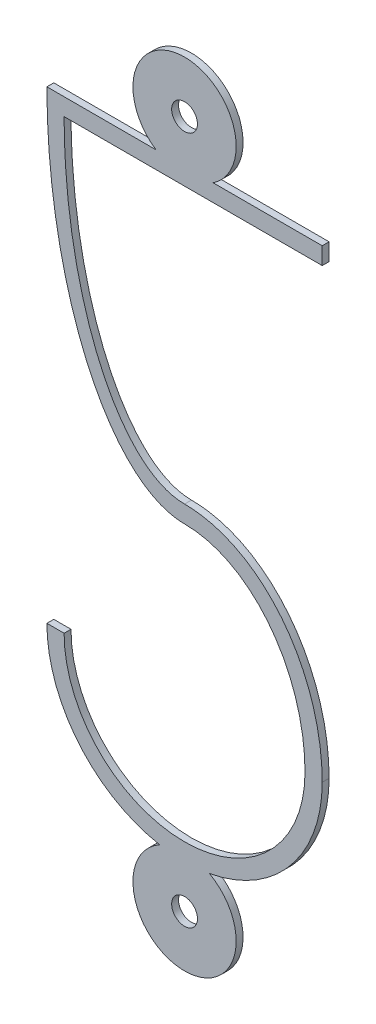
ISO-10303-21;
HEADER;
FILE_DESCRIPTION(('STEP AP214'),'2;1');
FILE_NAME('part.step','',(''),(''),'','','');
FILE_SCHEMA(('AUTOMOTIVE_DESIGN { 1 0 10303 214 1 1 1 1 }'));
ENDSEC;
DATA;
#1=APPLICATION_CONTEXT('core data for automotive mechanical design processes');
#2=APPLICATION_PROTOCOL_DEFINITION('international standard','automotive_design',2000,#1);
#3=PRODUCT_CONTEXT('',#1,'mechanical');
#4=PRODUCT('Part','Part','',(#3));
#5=PRODUCT_RELATED_PRODUCT_CATEGORY('part','',(#4));
#6=PRODUCT_DEFINITION_FORMATION('','',#4);
#7=PRODUCT_DEFINITION_CONTEXT('part definition',#1,'design');
#8=PRODUCT_DEFINITION('design','',#6,#7);
#9=PRODUCT_DEFINITION_SHAPE('','',#8);
#10=(LENGTH_UNIT() NAMED_UNIT(*) SI_UNIT(.MILLI.,.METRE.));
#11=(NAMED_UNIT(*) PLANE_ANGLE_UNIT() SI_UNIT($,.RADIAN.));
#12=(NAMED_UNIT(*) SI_UNIT($,.STERADIAN.) SOLID_ANGLE_UNIT());
#13=UNCERTAINTY_MEASURE_WITH_UNIT(LENGTH_MEASURE(1.E-05),#10,'distance_accuracy_value','');
#14=(GEOMETRIC_REPRESENTATION_CONTEXT(3) GLOBAL_UNCERTAINTY_ASSIGNED_CONTEXT((#13)) GLOBAL_UNIT_ASSIGNED_CONTEXT((#10,
#11,#12)) REPRESENTATION_CONTEXT('',''));
#15=CARTESIAN_POINT('',(0.,0.,0.));
#16=DIRECTION('',(0.,0.,1.));
#17=DIRECTION('',(1.,0.,0.));
#18=AXIS2_PLACEMENT_3D('',#15,#16,#17);
#19=CARTESIAN_POINT('',(-1.32932183617601E-13,8.75000000000002,0.1));
#20=DIRECTION('',(0.,0.,-1.));
#21=DIRECTION('',(-1.,0.,0.));
#22=AXIS2_PLACEMENT_3D('',#19,#20,#21);
#23=PLANE('',#22);
#24=CARTESIAN_POINT('',(-1.32932183617601E-13,8.75000000000002,0.1));
#25=DIRECTION('',(0.,0.,1.));
#26=DIRECTION('',(0.,1.,0.));
#27=AXIS2_PLACEMENT_3D('',#24,#25,#26);
#28=ELLIPSE('',#27,8.99999999999974,4.00000000000008);
#29=CARTESIAN_POINT('',(-4.00000000000022,8.74999999999979,0.1));
#30=VERTEX_POINT('',#29);
#31=CARTESIAN_POINT('',(0.,-0.250000000000186,0.1));
#32=VERTEX_POINT('',#31);
#33=EDGE_CURVE('E197',#30,#32,#28,.T.);
#34=ORIENTED_EDGE('',*,*,#33,.T.);
#35=CARTESIAN_POINT('',(0.,-4.74999999999968,0.1));
#36=DIRECTION('',(0.,0.,-1.));
#37=DIRECTION('',(0.,1.,0.));
#38=AXIS2_PLACEMENT_3D('',#35,#36,#37);
#39=ELLIPSE('',#38,4.49999999999949,3.49999999999958);
#40=CARTESIAN_POINT('',(3.49999999999954,-4.74999999999968,0.1));
#41=VERTEX_POINT('',#40);
#42=EDGE_CURVE('E115',#32,#41,#39,.T.);
#43=ORIENTED_EDGE('',*,*,#42,.T.);
#44=CARTESIAN_POINT('',(0.,-4.74999999999968,0.1));
#45=DIRECTION('',(0.,0.,-1.));
#46=DIRECTION('',(-1.,0.,0.));
#47=AXIS2_PLACEMENT_3D('',#44,#45,#46);
#48=CIRCLE('',#47,3.49999999999954);
#49=CARTESIAN_POINT('',(-3.49999999999949,-4.74999999999968,0.1));
#50=VERTEX_POINT('',#49);
#51=EDGE_CURVE('E230',#41,#50,#48,.T.);
#52=ORIENTED_EDGE('',*,*,#51,.T.);
#53=DIRECTION('',(-1.,0.,0.));
#54=VECTOR('',#53,1.);
#55=CARTESIAN_POINT('',(-4.00000000000022,-4.74999999999968,0.1));
#56=LINE('',#55,#54);
#57=CARTESIAN_POINT('',(-4.00000000000021,-4.74999999999968,0.1));
#58=VERTEX_POINT('',#57);
#59=EDGE_CURVE('E249',#50,#58,#56,.T.);
#60=ORIENTED_EDGE('',*,*,#59,.T.);
#61=CARTESIAN_POINT('',(0.,-4.74999999999968,0.1));
#62=DIRECTION('',(0.,0.,1.));
#63=DIRECTION('',(1.,0.,0.));
#64=AXIS2_PLACEMENT_3D('',#61,#62,#63);
#65=CIRCLE('',#64,4.00000000000021);
#66=CARTESIAN_POINT('',(-0.720779017653949,-8.68452380952371,0.1));
#67=VERTEX_POINT('',#66);
#68=EDGE_CURVE('E246',#58,#67,#65,.T.);
#69=ORIENTED_EDGE('',*,*,#68,.T.);
#70=CARTESIAN_POINT('',(-1.32932183617601E-13,-10.,0.1));
#71=DIRECTION('',(0.,0.,1.));
#72=DIRECTION('',(1.,0.,0.));
#73=AXIS2_PLACEMENT_3D('',#70,#71,#72);
#74=CIRCLE('',#73,1.5);
#75=CARTESIAN_POINT('',(0.720779017653747,-8.68452380952375,0.1));
#76=VERTEX_POINT('',#75);
#77=EDGE_CURVE('E248',#67,#76,#74,.T.);
#78=ORIENTED_EDGE('',*,*,#77,.T.);
#79=CARTESIAN_POINT('',(0.,-4.74999999999968,0.1));
#80=DIRECTION('',(0.,0.,1.));
#81=DIRECTION('',(1.,0.,0.));
#82=AXIS2_PLACEMENT_3D('',#79,#80,#81);
#83=CIRCLE('',#82,4.00000000000022);
#84=CARTESIAN_POINT('',(4.00000000000022,-4.74999999999968,0.1));
#85=VERTEX_POINT('',#84);
#86=EDGE_CURVE('E251',#76,#85,#83,.T.);
#87=ORIENTED_EDGE('',*,*,#86,.T.);
#88=CARTESIAN_POINT('',(0.,-4.74999999999968,0.1));
#89=DIRECTION('',(0.,0.,1.));
#90=DIRECTION('',(0.,1.,0.));
#91=AXIS2_PLACEMENT_3D('',#88,#89,#90);
#92=ELLIPSE('',#91,4.99999999999986,4.00000000000022);
#93=CARTESIAN_POINT('',(0.,0.250000000000188,0.1));
#94=VERTEX_POINT('',#93);
#95=EDGE_CURVE('E257',#85,#94,#92,.T.);
#96=ORIENTED_EDGE('',*,*,#95,.T.);
#97=CARTESIAN_POINT('',(-1.32932183617601E-13,8.24999999999906,0.1));
#98=DIRECTION('',(0.,0.,-1.));
#99=DIRECTION('',(0.,-1.,0.));
#100=AXIS2_PLACEMENT_3D('',#97,#98,#99);
#101=ELLIPSE('',#100,7.99999999999887,3.49999999999982);
#102=CARTESIAN_POINT('',(-3.49999999999995,8.24999999999906,0.1));
#103=VERTEX_POINT('',#102);
#104=EDGE_CURVE('E260',#94,#103,#101,.T.);
#105=ORIENTED_EDGE('',*,*,#104,.T.);
#106=DIRECTION('',(1.,0.,0.));
#107=VECTOR('',#106,1.);
#108=CARTESIAN_POINT('',(4.00000000000022,8.24999999999906,0.1));
#109=LINE('',#108,#107);
#110=CARTESIAN_POINT('',(4.00000000000022,8.24999999999906,0.1));
#111=VERTEX_POINT('',#110);
#112=EDGE_CURVE('E302',#103,#111,#109,.T.);
#113=ORIENTED_EDGE('',*,*,#112,.T.);
#114=DIRECTION('',(0.,1.,0.));
#115=VECTOR('',#114,1.);
#116=CARTESIAN_POINT('',(4.00000000000022,8.74999999999979,0.1));
#117=LINE('',#116,#115);
#118=CARTESIAN_POINT('',(4.00000000000022,8.74999999999979,0.1));
#119=VERTEX_POINT('',#118);
#120=EDGE_CURVE('E152',#111,#119,#117,.T.);
#121=ORIENTED_EDGE('',*,*,#120,.T.);
#122=DIRECTION('',(-1.,0.,0.));
#123=VECTOR('',#122,1.);
#124=CARTESIAN_POINT('',(0.829156197588529,8.74999999999979,0.1));
#125=LINE('',#124,#123);
#126=CARTESIAN_POINT('',(0.829156197588468,8.74999999999988,0.1));
#127=VERTEX_POINT('',#126);
#128=EDGE_CURVE('E146',#119,#127,#125,.T.);
#129=ORIENTED_EDGE('',*,*,#128,.T.);
#130=CARTESIAN_POINT('',(-1.32932183617601E-13,10.,0.1));
#131=DIRECTION('',(0.,0.,1.));
#132=DIRECTION('',(1.,0.,0.));
#133=AXIS2_PLACEMENT_3D('',#130,#131,#132);
#134=CIRCLE('',#133,1.49999999999996);
#135=CARTESIAN_POINT('',(-0.829156197588745,8.75000000000002,0.1));
#136=VERTEX_POINT('',#135);
#137=EDGE_CURVE('E150',#127,#136,#134,.T.);
#138=ORIENTED_EDGE('',*,*,#137,.T.);
#139=DIRECTION('',(-1.,0.,0.));
#140=VECTOR('',#139,1.);
#141=CARTESIAN_POINT('',(-4.00000000000022,8.74999999999979,0.1));
#142=LINE('',#141,#140);
#143=EDGE_CURVE('E54',#136,#30,#142,.T.);
#144=ORIENTED_EDGE('',*,*,#143,.T.);
#145=EDGE_LOOP('',(#34,#43,#52,#60,#69,#78,#87,#96,#105,#113,#121,#129,#138,#144));
#146=FACE_BOUND('',#145,.T.);
#147=CARTESIAN_POINT('',(-1.32932183617601E-13,-10.,0.1));
#148=DIRECTION('',(0.,0.,1.));
#149=DIRECTION('',(1.,0.,0.));
#150=AXIS2_PLACEMENT_3D('',#147,#148,#149);
#151=CIRCLE('',#150,0.374999999999808);
#152=CARTESIAN_POINT('',(0.374999999999675,-10.,0.1));
#153=VERTEX_POINT('',#152);
#154=EDGE_CURVE('E174',#153,#153,#151,.T.);
#155=ORIENTED_EDGE('',*,*,#154,.F.);
#156=EDGE_LOOP('',(#155));
#157=FACE_BOUND('',#156,.T.);
#158=CARTESIAN_POINT('',(-1.32932183617601E-13,10.,0.1));
#159=DIRECTION('',(0.,0.,1.));
#160=DIRECTION('',(1.,0.,0.));
#161=AXIS2_PLACEMENT_3D('',#158,#159,#160);
#162=CIRCLE('',#161,0.374999999999941);
#163=CARTESIAN_POINT('',(0.374999999999809,10.,0.1));
#164=VERTEX_POINT('',#163);
#165=EDGE_CURVE('E449',#164,#164,#162,.T.);
#166=ORIENTED_EDGE('',*,*,#165,.F.);
#167=EDGE_LOOP('',(#166));
#168=FACE_BOUND('',#167,.T.);
#169=ADVANCED_FACE('F36',(#146,#157,#168),#23,.F.);
#170=CARTESIAN_POINT('',(-1.32932183617601E-13,8.75000000000002,-0.1));
#171=DIRECTION('',(0.,0.,-1.));
#172=DIRECTION('',(-1.,0.,0.));
#173=AXIS2_PLACEMENT_3D('',#170,#171,#172);
#174=PLANE('',#173);
#175=CARTESIAN_POINT('',(-1.32932183617601E-13,-10.,-0.1));
#176=DIRECTION('',(0.,0.,1.));
#177=DIRECTION('',(1.,0.,0.));
#178=AXIS2_PLACEMENT_3D('',#175,#176,#177);
#179=CIRCLE('',#178,0.374999999999808);
#180=CARTESIAN_POINT('',(0.374999999999675,-10.,-0.1));
#181=VERTEX_POINT('',#180);
#182=EDGE_CURVE('E454',#181,#181,#179,.T.);
#183=ORIENTED_EDGE('',*,*,#182,.T.);
#184=EDGE_LOOP('',(#183));
#185=FACE_BOUND('',#184,.T.);
#186=CARTESIAN_POINT('',(-1.32932183617601E-13,8.75000000000002,-0.1));
#187=DIRECTION('',(0.,0.,1.));
#188=DIRECTION('',(0.,1.,0.));
#189=AXIS2_PLACEMENT_3D('',#186,#187,#188);
#190=ELLIPSE('',#189,8.99999999999974,4.00000000000008);
#191=CARTESIAN_POINT('',(-4.00000000000022,8.74999999999979,-0.1));
#192=VERTEX_POINT('',#191);
#193=CARTESIAN_POINT('',(0.,-0.250000000000186,-0.1));
#194=VERTEX_POINT('',#193);
#195=EDGE_CURVE('E170',#192,#194,#190,.T.);
#196=ORIENTED_EDGE('',*,*,#195,.F.);
#197=DIRECTION('',(-1.,0.,0.));
#198=VECTOR('',#197,1.);
#199=CARTESIAN_POINT('',(-4.00000000000022,8.74999999999979,-0.1));
#200=LINE('',#199,#198);
#201=CARTESIAN_POINT('',(-0.829156197588745,8.75000000000002,-0.1));
#202=VERTEX_POINT('',#201);
#203=EDGE_CURVE('E107',#202,#192,#200,.T.);
#204=ORIENTED_EDGE('',*,*,#203,.F.);
#205=CARTESIAN_POINT('',(-1.32932183617601E-13,10.,-0.1));
#206=DIRECTION('',(0.,0.,1.));
#207=DIRECTION('',(1.,0.,0.));
#208=AXIS2_PLACEMENT_3D('',#205,#206,#207);
#209=CIRCLE('',#208,1.49999999999996);
#210=CARTESIAN_POINT('',(0.829156197588468,8.74999999999988,-0.1));
#211=VERTEX_POINT('',#210);
#212=EDGE_CURVE('E101',#211,#202,#209,.T.);
#213=ORIENTED_EDGE('',*,*,#212,.F.);
#214=DIRECTION('',(-1.,0.,0.));
#215=VECTOR('',#214,1.);
#216=CARTESIAN_POINT('',(0.829156197588529,8.74999999999979,-0.1));
#217=LINE('',#216,#215);
#218=CARTESIAN_POINT('',(4.00000000000022,8.74999999999979,-0.1));
#219=VERTEX_POINT('',#218);
#220=EDGE_CURVE('E160',#219,#211,#217,.T.);
#221=ORIENTED_EDGE('',*,*,#220,.F.);
#222=DIRECTION('',(0.,1.,0.));
#223=VECTOR('',#222,1.);
#224=CARTESIAN_POINT('',(4.00000000000022,8.74999999999979,-0.1));
#225=LINE('',#224,#223);
#226=CARTESIAN_POINT('',(4.00000000000022,8.24999999999906,-0.1));
#227=VERTEX_POINT('',#226);
#228=EDGE_CURVE('E192',#227,#219,#225,.T.);
#229=ORIENTED_EDGE('',*,*,#228,.F.);
#230=DIRECTION('',(1.,0.,0.));
#231=VECTOR('',#230,1.);
#232=CARTESIAN_POINT('',(4.00000000000022,8.24999999999906,-0.1));
#233=LINE('',#232,#231);
#234=CARTESIAN_POINT('',(-3.49999999999995,8.24999999999906,-0.1));
#235=VERTEX_POINT('',#234);
#236=EDGE_CURVE('E190',#235,#227,#233,.T.);
#237=ORIENTED_EDGE('',*,*,#236,.F.);
#238=CARTESIAN_POINT('',(-1.32932183617601E-13,8.24999999999906,-0.1));
#239=DIRECTION('',(0.,0.,-1.));
#240=DIRECTION('',(0.,-1.,0.));
#241=AXIS2_PLACEMENT_3D('',#238,#239,#240);
#242=ELLIPSE('',#241,7.99999999999887,3.49999999999982);
#243=CARTESIAN_POINT('',(0.,0.250000000000188,-0.1));
#244=VERTEX_POINT('',#243);
#245=EDGE_CURVE('E188',#244,#235,#242,.T.);
#246=ORIENTED_EDGE('',*,*,#245,.F.);
#247=CARTESIAN_POINT('',(0.,-4.74999999999968,-0.1));
#248=DIRECTION('',(0.,0.,1.));
#249=DIRECTION('',(0.,1.,0.));
#250=AXIS2_PLACEMENT_3D('',#247,#248,#249);
#251=ELLIPSE('',#250,4.99999999999986,4.00000000000022);
#252=CARTESIAN_POINT('',(4.00000000000022,-4.74999999999968,-0.1));
#253=VERTEX_POINT('',#252);
#254=EDGE_CURVE('E186',#253,#244,#251,.T.);
#255=ORIENTED_EDGE('',*,*,#254,.F.);
#256=CARTESIAN_POINT('',(0.,-4.74999999999968,-0.1));
#257=DIRECTION('',(0.,0.,1.));
#258=DIRECTION('',(1.,0.,0.));
#259=AXIS2_PLACEMENT_3D('',#256,#257,#258);
#260=CIRCLE('',#259,4.00000000000022);
#261=CARTESIAN_POINT('',(0.720779017653747,-8.68452380952375,-0.1));
#262=VERTEX_POINT('',#261);
#263=EDGE_CURVE('E184',#262,#253,#260,.T.);
#264=ORIENTED_EDGE('',*,*,#263,.F.);
#265=CARTESIAN_POINT('',(-1.32932183617601E-13,-10.,-0.1));
#266=DIRECTION('',(0.,0.,1.));
#267=DIRECTION('',(1.,0.,0.));
#268=AXIS2_PLACEMENT_3D('',#265,#266,#267);
#269=CIRCLE('',#268,1.5);
#270=CARTESIAN_POINT('',(-0.720779017653949,-8.68452380952371,-0.1));
#271=VERTEX_POINT('',#270);
#272=EDGE_CURVE('E182',#271,#262,#269,.T.);
#273=ORIENTED_EDGE('',*,*,#272,.F.);
#274=CARTESIAN_POINT('',(0.,-4.74999999999968,-0.1));
#275=DIRECTION('',(0.,0.,1.));
#276=DIRECTION('',(1.,0.,0.));
#277=AXIS2_PLACEMENT_3D('',#274,#275,#276);
#278=CIRCLE('',#277,4.00000000000021);
#279=CARTESIAN_POINT('',(-4.00000000000021,-4.74999999999968,-0.1));
#280=VERTEX_POINT('',#279);
#281=EDGE_CURVE('E180',#280,#271,#278,.T.);
#282=ORIENTED_EDGE('',*,*,#281,.F.);
#283=DIRECTION('',(-1.,0.,0.));
#284=VECTOR('',#283,1.);
#285=CARTESIAN_POINT('',(-4.00000000000022,-4.74999999999968,-0.1));
#286=LINE('',#285,#284);
#287=CARTESIAN_POINT('',(-3.49999999999949,-4.74999999999968,-0.1));
#288=VERTEX_POINT('',#287);
#289=EDGE_CURVE('E178',#288,#280,#286,.T.);
#290=ORIENTED_EDGE('',*,*,#289,.F.);
#291=CARTESIAN_POINT('',(0.,-4.74999999999968,-0.1));
#292=DIRECTION('',(0.,0.,-1.));
#293=DIRECTION('',(-1.,0.,0.));
#294=AXIS2_PLACEMENT_3D('',#291,#292,#293);
#295=CIRCLE('',#294,3.49999999999954);
#296=CARTESIAN_POINT('',(3.49999999999954,-4.74999999999968,-0.1));
#297=VERTEX_POINT('',#296);
#298=EDGE_CURVE('E176',#297,#288,#295,.T.);
#299=ORIENTED_EDGE('',*,*,#298,.F.);
#300=CARTESIAN_POINT('',(0.,-4.74999999999968,-0.1));
#301=DIRECTION('',(0.,0.,-1.));
#302=DIRECTION('',(0.,1.,0.));
#303=AXIS2_PLACEMENT_3D('',#300,#301,#302);
#304=ELLIPSE('',#303,4.49999999999949,3.49999999999958);
#305=EDGE_CURVE('E173',#194,#297,#304,.T.);
#306=ORIENTED_EDGE('',*,*,#305,.F.);
#307=EDGE_LOOP('',(#196,#204,#213,#221,#229,#237,#246,#255,#264,#273,#282,#290,#299,#306));
#308=FACE_BOUND('',#307,.T.);
#309=CARTESIAN_POINT('',(-1.32932183617601E-13,10.,-0.1));
#310=DIRECTION('',(0.,0.,1.));
#311=DIRECTION('',(1.,0.,0.));
#312=AXIS2_PLACEMENT_3D('',#309,#310,#311);
#313=CIRCLE('',#312,0.374999999999941);
#314=CARTESIAN_POINT('',(0.374999999999809,10.,-0.1));
#315=VERTEX_POINT('',#314);
#316=EDGE_CURVE('E452',#315,#315,#313,.T.);
#317=ORIENTED_EDGE('',*,*,#316,.T.);
#318=EDGE_LOOP('',(#317));
#319=FACE_BOUND('',#318,.T.);
#320=ADVANCED_FACE('F234',(#185,#308,#319),#174,.T.);
#321=DIRECTION('',(0.,0.,-1.));
#322=VECTOR('',#321,1.);
#323=SURFACE_OF_LINEAR_EXTRUSION('',#28,#322);
#324=ORIENTED_EDGE('',*,*,#195,.T.);
#325=DIRECTION('',(0.,0.,-1.));
#326=VECTOR('',#325,1.);
#327=CARTESIAN_POINT('',(0.,-0.250000000000186,0.1));
#328=LINE('',#327,#326);
#329=EDGE_CURVE('E11',#32,#194,#328,.T.);
#330=ORIENTED_EDGE('',*,*,#329,.F.);
#331=ORIENTED_EDGE('',*,*,#33,.F.);
#332=DIRECTION('',(0.,0.,-1.));
#333=VECTOR('',#332,1.);
#334=CARTESIAN_POINT('',(-4.00000000000022,8.74999999999979,0.1));
#335=LINE('',#334,#333);
#336=EDGE_CURVE('E166',#30,#192,#335,.T.);
#337=ORIENTED_EDGE('',*,*,#336,.T.);
#338=EDGE_LOOP('',(#324,#330,#331,#337));
#339=FACE_BOUND('',#338,.T.);
#340=ADVANCED_FACE('F38',(#339),#323,.F.);
#341=DIRECTION('',(0.,0.,-1.));
#342=VECTOR('',#341,1.);
#343=SURFACE_OF_LINEAR_EXTRUSION('',#39,#342);
#344=ORIENTED_EDGE('',*,*,#305,.T.);
#345=DIRECTION('',(0.,0.,-1.));
#346=VECTOR('',#345,1.);
#347=CARTESIAN_POINT('',(3.49999999999954,-4.74999999999968,0.1));
#348=LINE('',#347,#346);
#349=EDGE_CURVE('E46',#41,#297,#348,.T.);
#350=ORIENTED_EDGE('',*,*,#349,.F.);
#351=ORIENTED_EDGE('',*,*,#42,.F.);
#352=ORIENTED_EDGE('',*,*,#329,.T.);
#353=EDGE_LOOP('',(#344,#350,#351,#352));
#354=FACE_BOUND('',#353,.T.);
#355=ADVANCED_FACE('F284',(#354),#343,.F.);
#356=CARTESIAN_POINT('',(0.,-4.74999999999968,0.1));
#357=DIRECTION('',(0.,0.,-1.));
#358=DIRECTION('',(-1.,0.,0.));
#359=AXIS2_PLACEMENT_3D('',#356,#357,#358);
#360=CYLINDRICAL_SURFACE('',#359,3.49999999999954);
#361=ORIENTED_EDGE('',*,*,#298,.T.);
#362=DIRECTION('',(0.,0.,-1.));
#363=VECTOR('',#362,1.);
#364=CARTESIAN_POINT('',(-3.49999999999949,-4.74999999999968,0.1));
#365=LINE('',#364,#363);
#366=EDGE_CURVE('E222',#50,#288,#365,.T.);
#367=ORIENTED_EDGE('',*,*,#366,.F.);
#368=ORIENTED_EDGE('',*,*,#51,.F.);
#369=ORIENTED_EDGE('',*,*,#349,.T.);
#370=EDGE_LOOP('',(#361,#367,#368,#369));
#371=FACE_BOUND('',#370,.T.);
#372=ADVANCED_FACE('F228',(#371),#360,.F.);
#373=CARTESIAN_POINT('',(-4.00000000000022,-4.74999999999968,0.1));
#374=DIRECTION('',(0.,-1.,0.));
#375=DIRECTION('',(0.,0.,-1.));
#376=AXIS2_PLACEMENT_3D('',#373,#374,#375);
#377=PLANE('',#376);
#378=ORIENTED_EDGE('',*,*,#289,.T.);
#379=DIRECTION('',(0.,0.,-1.));
#380=VECTOR('',#379,1.);
#381=CARTESIAN_POINT('',(-4.00000000000021,-4.74999999999968,0.1));
#382=LINE('',#381,#380);
#383=EDGE_CURVE('E219',#58,#280,#382,.T.);
#384=ORIENTED_EDGE('',*,*,#383,.F.);
#385=ORIENTED_EDGE('',*,*,#59,.F.);
#386=ORIENTED_EDGE('',*,*,#366,.T.);
#387=EDGE_LOOP('',(#378,#384,#385,#386));
#388=FACE_BOUND('',#387,.T.);
#389=ADVANCED_FACE('F240',(#388),#377,.F.);
#390=CARTESIAN_POINT('',(0.,-4.74999999999968,0.1));
#391=DIRECTION('',(0.,0.,-1.));
#392=DIRECTION('',(-1.,0.,0.));
#393=AXIS2_PLACEMENT_3D('',#390,#391,#392);
#394=CYLINDRICAL_SURFACE('',#393,4.00000000000021);
#395=ORIENTED_EDGE('',*,*,#281,.T.);
#396=DIRECTION('',(0.,0.,-1.));
#397=VECTOR('',#396,1.);
#398=CARTESIAN_POINT('',(-0.720779017653949,-8.68452380952371,0.1));
#399=LINE('',#398,#397);
#400=EDGE_CURVE('E216',#67,#271,#399,.T.);
#401=ORIENTED_EDGE('',*,*,#400,.F.);
#402=ORIENTED_EDGE('',*,*,#68,.F.);
#403=ORIENTED_EDGE('',*,*,#383,.T.);
#404=EDGE_LOOP('',(#395,#401,#402,#403));
#405=FACE_BOUND('',#404,.T.);
#406=ADVANCED_FACE('F244',(#405),#394,.T.);
#407=CARTESIAN_POINT('',(-1.32932183617601E-13,-10.,0.1));
#408=DIRECTION('',(0.,0.,-1.));
#409=DIRECTION('',(-1.,0.,0.));
#410=AXIS2_PLACEMENT_3D('',#407,#408,#409);
#411=CYLINDRICAL_SURFACE('',#410,1.5);
#412=ORIENTED_EDGE('',*,*,#272,.T.);
#413=DIRECTION('',(0.,0.,-1.));
#414=VECTOR('',#413,1.);
#415=CARTESIAN_POINT('',(0.720779017653747,-8.68452380952375,0.1));
#416=LINE('',#415,#414);
#417=EDGE_CURVE('E213',#76,#262,#416,.T.);
#418=ORIENTED_EDGE('',*,*,#417,.F.);
#419=ORIENTED_EDGE('',*,*,#77,.F.);
#420=ORIENTED_EDGE('',*,*,#400,.T.);
#421=EDGE_LOOP('',(#412,#418,#419,#420));
#422=FACE_BOUND('',#421,.T.);
#423=ADVANCED_FACE('F274',(#422),#411,.T.);
#424=CARTESIAN_POINT('',(0.,-4.74999999999968,0.1));
#425=DIRECTION('',(0.,0.,-1.));
#426=DIRECTION('',(-1.,0.,0.));
#427=AXIS2_PLACEMENT_3D('',#424,#425,#426);
#428=CYLINDRICAL_SURFACE('',#427,4.00000000000022);
#429=ORIENTED_EDGE('',*,*,#263,.T.);
#430=DIRECTION('',(0.,0.,-1.));
#431=VECTOR('',#430,1.);
#432=CARTESIAN_POINT('',(4.00000000000022,-4.74999999999968,0.1));
#433=LINE('',#432,#431);
#434=EDGE_CURVE('E210',#85,#253,#433,.T.);
#435=ORIENTED_EDGE('',*,*,#434,.F.);
#436=ORIENTED_EDGE('',*,*,#86,.F.);
#437=ORIENTED_EDGE('',*,*,#417,.T.);
#438=EDGE_LOOP('',(#429,#435,#436,#437));
#439=FACE_BOUND('',#438,.T.);
#440=ADVANCED_FACE('F269',(#439),#428,.T.);
#441=DIRECTION('',(0.,0.,-1.));
#442=VECTOR('',#441,1.);
#443=SURFACE_OF_LINEAR_EXTRUSION('',#92,#442);
#444=ORIENTED_EDGE('',*,*,#254,.T.);
#445=DIRECTION('',(0.,0.,-1.));
#446=VECTOR('',#445,1.);
#447=CARTESIAN_POINT('',(0.,0.250000000000188,0.1));
#448=LINE('',#447,#446);
#449=EDGE_CURVE('E207',#94,#244,#448,.T.);
#450=ORIENTED_EDGE('',*,*,#449,.F.);
#451=ORIENTED_EDGE('',*,*,#95,.F.);
#452=ORIENTED_EDGE('',*,*,#434,.T.);
#453=EDGE_LOOP('',(#444,#450,#451,#452));
#454=FACE_BOUND('',#453,.T.);
#455=ADVANCED_FACE('F264',(#454),#443,.F.);
#456=DIRECTION('',(0.,0.,-1.));
#457=VECTOR('',#456,1.);
#458=SURFACE_OF_LINEAR_EXTRUSION('',#101,#457);
#459=ORIENTED_EDGE('',*,*,#245,.T.);
#460=DIRECTION('',(0.,0.,-1.));
#461=VECTOR('',#460,1.);
#462=CARTESIAN_POINT('',(-3.49999999999995,8.24999999999906,0.1));
#463=LINE('',#462,#461);
#464=EDGE_CURVE('E204',#103,#235,#463,.T.);
#465=ORIENTED_EDGE('',*,*,#464,.F.);
#466=ORIENTED_EDGE('',*,*,#104,.F.);
#467=ORIENTED_EDGE('',*,*,#449,.T.);
#468=EDGE_LOOP('',(#459,#465,#466,#467));
#469=FACE_BOUND('',#468,.T.);
#470=ADVANCED_FACE('F268',(#469),#458,.F.);
#471=CARTESIAN_POINT('',(4.00000000000022,8.24999999999906,0.1));
#472=DIRECTION('',(0.,1.,0.));
#473=DIRECTION('',(0.,0.,1.));
#474=AXIS2_PLACEMENT_3D('',#471,#472,#473);
#475=PLANE('',#474);
#476=ORIENTED_EDGE('',*,*,#236,.T.);
#477=DIRECTION('',(0.,0.,-1.));
#478=VECTOR('',#477,1.);
#479=CARTESIAN_POINT('',(4.00000000000022,8.24999999999906,0.1));
#480=LINE('',#479,#478);
#481=EDGE_CURVE('E201',#111,#227,#480,.T.);
#482=ORIENTED_EDGE('',*,*,#481,.F.);
#483=ORIENTED_EDGE('',*,*,#112,.F.);
#484=ORIENTED_EDGE('',*,*,#464,.T.);
#485=EDGE_LOOP('',(#476,#482,#483,#484));
#486=FACE_BOUND('',#485,.T.);
#487=ADVANCED_FACE('F301',(#486),#475,.F.);
#488=CARTESIAN_POINT('',(4.00000000000022,8.74999999999979,0.1));
#489=DIRECTION('',(-1.,0.,0.));
#490=DIRECTION('',(0.,0.,1.));
#491=AXIS2_PLACEMENT_3D('',#488,#489,#490);
#492=PLANE('',#491);
#493=ORIENTED_EDGE('',*,*,#228,.T.);
#494=DIRECTION('',(0.,0.,-1.));
#495=VECTOR('',#494,1.);
#496=CARTESIAN_POINT('',(4.00000000000022,8.74999999999979,0.1));
#497=LINE('',#496,#495);
#498=EDGE_CURVE('E161',#119,#219,#497,.T.);
#499=ORIENTED_EDGE('',*,*,#498,.F.);
#500=ORIENTED_EDGE('',*,*,#120,.F.);
#501=ORIENTED_EDGE('',*,*,#481,.T.);
#502=EDGE_LOOP('',(#493,#499,#500,#501));
#503=FACE_BOUND('',#502,.T.);
#504=ADVANCED_FACE('F297',(#503),#492,.F.);
#505=CARTESIAN_POINT('',(0.829156197588529,8.74999999999979,0.1));
#506=DIRECTION('',(0.,-1.,0.));
#507=DIRECTION('',(0.,0.,-1.));
#508=AXIS2_PLACEMENT_3D('',#505,#506,#507);
#509=PLANE('',#508);
#510=ORIENTED_EDGE('',*,*,#220,.T.);
#511=DIRECTION('',(0.,0.,-1.));
#512=VECTOR('',#511,1.);
#513=CARTESIAN_POINT('',(0.829156197588468,8.74999999999988,0.1));
#514=LINE('',#513,#512);
#515=EDGE_CURVE('E157',#127,#211,#514,.T.);
#516=ORIENTED_EDGE('',*,*,#515,.F.);
#517=ORIENTED_EDGE('',*,*,#128,.F.);
#518=ORIENTED_EDGE('',*,*,#498,.T.);
#519=EDGE_LOOP('',(#510,#516,#517,#518));
#520=FACE_BOUND('',#519,.T.);
#521=ADVANCED_FACE('F158',(#520),#509,.F.);
#522=CARTESIAN_POINT('',(-1.32932183617601E-13,10.,0.1));
#523=DIRECTION('',(0.,0.,-1.));
#524=DIRECTION('',(-1.,0.,0.));
#525=AXIS2_PLACEMENT_3D('',#522,#523,#524);
#526=CYLINDRICAL_SURFACE('',#525,1.49999999999996);
#527=ORIENTED_EDGE('',*,*,#212,.T.);
#528=DIRECTION('',(0.,0.,-1.));
#529=VECTOR('',#528,1.);
#530=CARTESIAN_POINT('',(-0.829156197588745,8.75000000000002,0.1));
#531=LINE('',#530,#529);
#532=EDGE_CURVE('E162',#136,#202,#531,.T.);
#533=ORIENTED_EDGE('',*,*,#532,.F.);
#534=ORIENTED_EDGE('',*,*,#137,.F.);
#535=ORIENTED_EDGE('',*,*,#515,.T.);
#536=EDGE_LOOP('',(#527,#533,#534,#535));
#537=FACE_BOUND('',#536,.T.);
#538=ADVANCED_FACE('F164',(#537),#526,.T.);
#539=CARTESIAN_POINT('',(-4.00000000000022,8.74999999999979,0.1));
#540=DIRECTION('',(0.,-1.,0.));
#541=DIRECTION('',(1.,0.,0.));
#542=AXIS2_PLACEMENT_3D('',#539,#540,#541);
#543=PLANE('',#542);
#544=ORIENTED_EDGE('',*,*,#203,.T.);
#545=ORIENTED_EDGE('',*,*,#336,.F.);
#546=ORIENTED_EDGE('',*,*,#143,.F.);
#547=ORIENTED_EDGE('',*,*,#532,.T.);
#548=EDGE_LOOP('',(#544,#545,#546,#547));
#549=FACE_BOUND('',#548,.T.);
#550=ADVANCED_FACE('F328',(#549),#543,.F.);
#551=CARTESIAN_POINT('',(-1.32932183617601E-13,-10.,0.1));
#552=DIRECTION('',(0.,0.,-1.));
#553=DIRECTION('',(-1.,0.,0.));
#554=AXIS2_PLACEMENT_3D('',#551,#552,#553);
#555=CYLINDRICAL_SURFACE('',#554,0.374999999999808);
#556=ORIENTED_EDGE('',*,*,#154,.T.);
#557=EDGE_LOOP('',(#556));
#558=FACE_BOUND('',#557,.T.);
#559=ORIENTED_EDGE('',*,*,#182,.F.);
#560=EDGE_LOOP('',(#559));
#561=FACE_BOUND('',#560,.T.);
#562=ADVANCED_FACE('F325',(#558,#561),#555,.F.);
#563=CARTESIAN_POINT('',(-1.32932183617601E-13,10.,0.1));
#564=DIRECTION('',(0.,0.,-1.));
#565=DIRECTION('',(-1.,0.,0.));
#566=AXIS2_PLACEMENT_3D('',#563,#564,#565);
#567=CYLINDRICAL_SURFACE('',#566,0.374999999999941);
#568=ORIENTED_EDGE('',*,*,#165,.T.);
#569=EDGE_LOOP('',(#568));
#570=FACE_BOUND('',#569,.T.);
#571=ORIENTED_EDGE('',*,*,#316,.F.);
#572=EDGE_LOOP('',(#571));
#573=FACE_BOUND('',#572,.T.);
#574=ADVANCED_FACE('F358',(#570,#573),#567,.F.);
#575=CLOSED_SHELL('',(#169,#320,#340,#355,#372,#389,#406,#423,#440,#455,#470,#487,#504,#521,
#538,#550,#562,#574));
#576=MANIFOLD_SOLID_BREP('B2',#575);
#577=ADVANCED_BREP_SHAPE_REPRESENTATION('',(#18,#576),#14);
#578=SHAPE_DEFINITION_REPRESENTATION(#9,#577);
ENDSEC;
END-ISO-10303-21;
